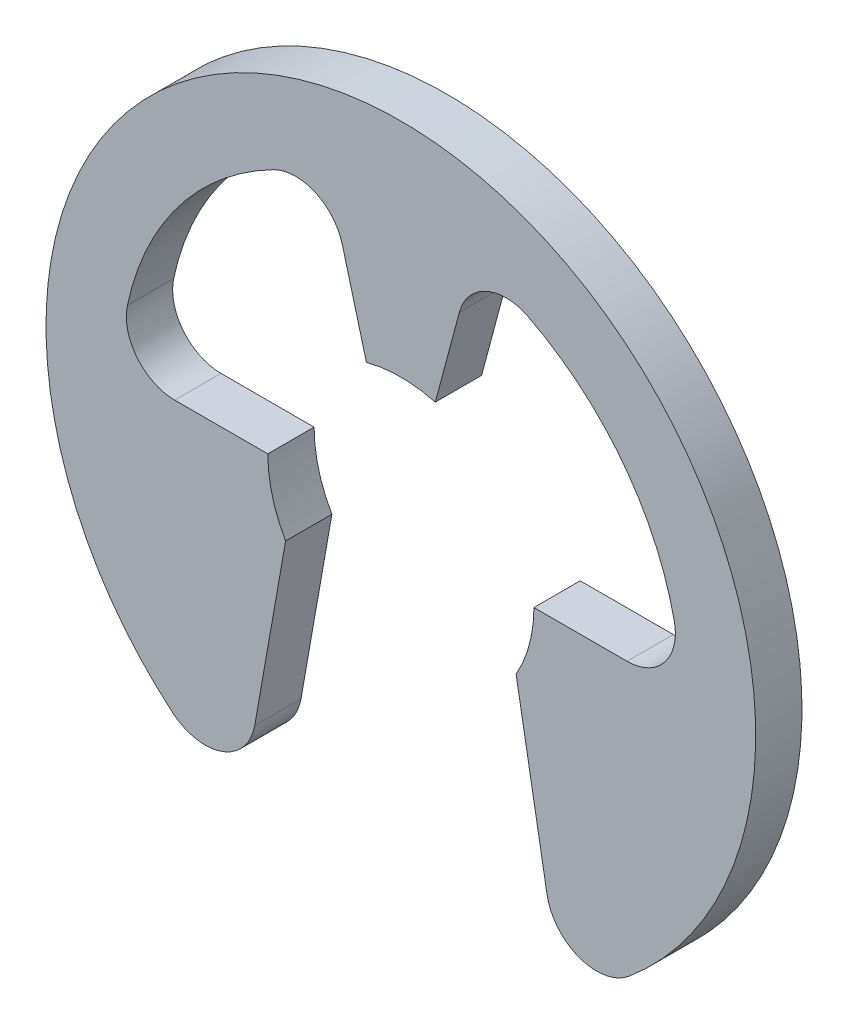
ISO-10303-21;
HEADER;
FILE_DESCRIPTION(('STEP AP214'),'2;1');
FILE_NAME('part.step','',(''),(''),'','','');
FILE_SCHEMA(('AUTOMOTIVE_DESIGN { 1 0 10303 214 1 1 1 1 }'));
ENDSEC;
DATA;
#1=APPLICATION_CONTEXT('core data for automotive mechanical design processes');
#2=APPLICATION_PROTOCOL_DEFINITION('international standard','automotive_design',2000,#1);
#3=PRODUCT_CONTEXT('',#1,'mechanical');
#4=PRODUCT('Part','Part','',(#3));
#5=PRODUCT_RELATED_PRODUCT_CATEGORY('part','',(#4));
#6=PRODUCT_DEFINITION_FORMATION('','',#4);
#7=PRODUCT_DEFINITION_CONTEXT('part definition',#1,'design');
#8=PRODUCT_DEFINITION('design','',#6,#7);
#9=PRODUCT_DEFINITION_SHAPE('','',#8);
#10=(LENGTH_UNIT() NAMED_UNIT(*) SI_UNIT(.MILLI.,.METRE.));
#11=(NAMED_UNIT(*) PLANE_ANGLE_UNIT() SI_UNIT($,.RADIAN.));
#12=(NAMED_UNIT(*) SI_UNIT($,.STERADIAN.) SOLID_ANGLE_UNIT());
#13=UNCERTAINTY_MEASURE_WITH_UNIT(LENGTH_MEASURE(1.E-05),#10,'distance_accuracy_value','');
#14=(GEOMETRIC_REPRESENTATION_CONTEXT(3) GLOBAL_UNCERTAINTY_ASSIGNED_CONTEXT((#13)) GLOBAL_UNIT_ASSIGNED_CONTEXT((#10,
#11,#12)) REPRESENTATION_CONTEXT('',''));
#15=CARTESIAN_POINT('',(0.,0.,0.));
#16=DIRECTION('',(0.,0.,1.));
#17=DIRECTION('',(1.,0.,0.));
#18=AXIS2_PLACEMENT_3D('',#15,#16,#17);
#19=CARTESIAN_POINT('',(1.95446781616986,0.418,-0.4));
#20=DIRECTION('',(0.,0.,1.));
#21=DIRECTION('',(1.,0.,0.));
#22=AXIS2_PLACEMENT_3D('',#19,#20,#21);
#23=CYLINDRICAL_SURFACE('',#22,0.418);
#24=CARTESIAN_POINT('',(1.95446781616986,0.418,0.));
#25=DIRECTION('',(0.,0.,-1.));
#26=DIRECTION('',(1.,0.,0.));
#27=AXIS2_PLACEMENT_3D('',#24,#25,#26);
#28=CIRCLE('',#27,0.418);
#29=CARTESIAN_POINT('',(2.36322409393457,0.505420280186798,0.));
#30=VERTEX_POINT('',#29);
#31=CARTESIAN_POINT('',(1.95446781616986,0.,0.));
#32=VERTEX_POINT('',#31);
#33=EDGE_CURVE('E194',#30,#32,#28,.T.);
#34=ORIENTED_EDGE('',*,*,#33,.F.);
#35=DIRECTION('',(0.,0.,1.));
#36=VECTOR('',#35,1.);
#37=CARTESIAN_POINT('',(2.36322409393457,0.505420280186798,-0.4));
#38=LINE('',#37,#36);
#39=CARTESIAN_POINT('',(2.36322409393457,0.505420280186798,-0.4));
#40=VERTEX_POINT('',#39);
#41=EDGE_CURVE('E11',#40,#30,#38,.T.);
#42=ORIENTED_EDGE('',*,*,#41,.F.);
#43=CARTESIAN_POINT('',(1.95446781616986,0.418,-0.4));
#44=DIRECTION('',(0.,0.,-1.));
#45=DIRECTION('',(1.,0.,0.));
#46=AXIS2_PLACEMENT_3D('',#43,#44,#45);
#47=CIRCLE('',#46,0.418);
#48=CARTESIAN_POINT('',(1.95446781616986,0.,-0.4));
#49=VERTEX_POINT('',#48);
#50=EDGE_CURVE('E244',#40,#49,#47,.T.);
#51=ORIENTED_EDGE('',*,*,#50,.T.);
#52=DIRECTION('',(0.,0.,1.));
#53=VECTOR('',#52,1.);
#54=CARTESIAN_POINT('',(1.95446781616986,0.,-0.4));
#55=LINE('',#54,#53);
#56=EDGE_CURVE('E40',#49,#32,#55,.T.);
#57=ORIENTED_EDGE('',*,*,#56,.T.);
#58=EDGE_LOOP('',(#34,#42,#51,#57));
#59=FACE_BOUND('',#58,.T.);
#60=ADVANCED_FACE('F37',(#59),#23,.F.);
#61=CARTESIAN_POINT('',(0.,0.,-0.4));
#62=DIRECTION('',(0.,0.,1.));
#63=DIRECTION('',(1.,0.,0.));
#64=AXIS2_PLACEMENT_3D('',#61,#62,#63);
#65=CYLINDRICAL_SURFACE('',#64,2.4166666666665);
#66=CARTESIAN_POINT('',(0.,0.,0.));
#67=DIRECTION('',(0.,0.,-1.));
#68=DIRECTION('',(1.,0.,0.));
#69=AXIS2_PLACEMENT_3D('',#66,#67,#68);
#70=CIRCLE('',#69,2.4166666666665);
#71=CARTESIAN_POINT('',(1.0998459051181,2.15188679134659,0.));
#72=VERTEX_POINT('',#71);
#73=EDGE_CURVE('E242',#72,#30,#70,.T.);
#74=ORIENTED_EDGE('',*,*,#73,.F.);
#75=DIRECTION('',(0.,0.,1.));
#76=VECTOR('',#75,1.);
#77=CARTESIAN_POINT('',(1.0998459051181,2.15188679134659,-0.4));
#78=LINE('',#77,#76);
#79=CARTESIAN_POINT('',(1.0998459051181,2.15188679134659,-0.4));
#80=VERTEX_POINT('',#79);
#81=EDGE_CURVE('E46',#80,#72,#78,.T.);
#82=ORIENTED_EDGE('',*,*,#81,.F.);
#83=CARTESIAN_POINT('',(0.,0.,-0.4));
#84=DIRECTION('',(0.,0.,-1.));
#85=DIRECTION('',(1.,0.,0.));
#86=AXIS2_PLACEMENT_3D('',#83,#84,#85);
#87=CIRCLE('',#86,2.4166666666665);
#88=EDGE_CURVE('E184',#80,#40,#87,.T.);
#89=ORIENTED_EDGE('',*,*,#88,.T.);
#90=ORIENTED_EDGE('',*,*,#41,.T.);
#91=EDGE_LOOP('',(#74,#82,#89,#90));
#92=FACE_BOUND('',#91,.T.);
#93=ADVANCED_FACE('F276',(#92),#65,.F.);
#94=CARTESIAN_POINT('',(0.909610489253524,1.77968457943641,-0.4));
#95=DIRECTION('',(0.,0.,1.));
#96=DIRECTION('',(1.,0.,0.));
#97=AXIS2_PLACEMENT_3D('',#94,#95,#96);
#98=CYLINDRICAL_SURFACE('',#97,0.418);
#99=CARTESIAN_POINT('',(0.909610489253524,1.77968457943641,0.));
#100=DIRECTION('',(0.,0.,-1.));
#101=DIRECTION('',(1.,0.,0.));
#102=AXIS2_PLACEMENT_3D('',#99,#100,#101);
#103=CIRCLE('',#102,0.418);
#104=CARTESIAN_POINT('',(0.505853493864694,1.88787094028926,0.));
#105=VERTEX_POINT('',#104);
#106=EDGE_CURVE('E171',#105,#72,#103,.T.);
#107=ORIENTED_EDGE('',*,*,#106,.F.);
#108=DIRECTION('',(0.,0.,1.));
#109=VECTOR('',#108,1.);
#110=CARTESIAN_POINT('',(0.505853493864694,1.88787094028926,-0.4));
#111=LINE('',#110,#109);
#112=CARTESIAN_POINT('',(0.505853493864694,1.88787094028926,-0.4));
#113=VERTEX_POINT('',#112);
#114=EDGE_CURVE('E166',#113,#105,#111,.T.);
#115=ORIENTED_EDGE('',*,*,#114,.F.);
#116=CARTESIAN_POINT('',(0.909610489253524,1.77968457943641,-0.4));
#117=DIRECTION('',(0.,0.,-1.));
#118=DIRECTION('',(1.,0.,0.));
#119=AXIS2_PLACEMENT_3D('',#116,#117,#118);
#120=CIRCLE('',#119,0.418);
#121=EDGE_CURVE('E169',#113,#80,#120,.T.);
#122=ORIENTED_EDGE('',*,*,#121,.T.);
#123=ORIENTED_EDGE('',*,*,#81,.T.);
#124=EDGE_LOOP('',(#107,#115,#122,#123));
#125=FACE_BOUND('',#124,.T.);
#126=ADVANCED_FACE('F168',(#125),#98,.F.);
#127=CARTESIAN_POINT('',(0.2976419018679,1.11081470023243,-0.4));
#128=DIRECTION('',(0.965925826289068,-0.258819045102522,0.));
#129=DIRECTION('',(0.258819045102522,0.965925826289068,0.));
#130=AXIS2_PLACEMENT_3D('',#127,#128,#129);
#131=PLANE('',#130);
#132=DIRECTION('',(0.258819045102522,0.965925826289068,0.));
#133=VECTOR('',#132,1.);
#134=CARTESIAN_POINT('',(0.2976419018679,1.11081470023243,0.));
#135=LINE('',#134,#133);
#136=CARTESIAN_POINT('',(0.2976419018679,1.11081470023243,0.));
#137=VERTEX_POINT('',#136);
#138=EDGE_CURVE('E239',#137,#105,#135,.T.);
#139=ORIENTED_EDGE('',*,*,#138,.F.);
#140=DIRECTION('',(0.,0.,1.));
#141=VECTOR('',#140,1.);
#142=CARTESIAN_POINT('',(0.2976419018679,1.11081470023243,-0.4));
#143=LINE('',#142,#141);
#144=CARTESIAN_POINT('',(0.2976419018679,1.11081470023243,-0.4));
#145=VERTEX_POINT('',#144);
#146=EDGE_CURVE('E176',#145,#137,#143,.T.);
#147=ORIENTED_EDGE('',*,*,#146,.F.);
#148=DIRECTION('',(0.258819045102522,0.965925826289068,0.));
#149=VECTOR('',#148,1.);
#150=CARTESIAN_POINT('',(0.2976419018679,1.11081470023243,-0.4));
#151=LINE('',#150,#149);
#152=EDGE_CURVE('E182',#145,#113,#151,.T.);
#153=ORIENTED_EDGE('',*,*,#152,.T.);
#154=ORIENTED_EDGE('',*,*,#114,.T.);
#155=EDGE_LOOP('',(#139,#147,#153,#154));
#156=FACE_BOUND('',#155,.T.);
#157=ADVANCED_FACE('F186',(#156),#131,.T.);
#158=CARTESIAN_POINT('',(0.,0.,-0.4));
#159=DIRECTION('',(0.,0.,1.));
#160=DIRECTION('',(1.,0.,0.));
#161=AXIS2_PLACEMENT_3D('',#158,#159,#160);
#162=CYLINDRICAL_SURFACE('',#161,1.15);
#163=CARTESIAN_POINT('',(0.,0.,0.));
#164=DIRECTION('',(0.,0.,-1.));
#165=DIRECTION('',(-1.,0.,0.));
#166=AXIS2_PLACEMENT_3D('',#163,#164,#165);
#167=CIRCLE('',#166,1.15);
#168=CARTESIAN_POINT('',(-0.2976419018679,1.11081470023243,0.));
#169=VERTEX_POINT('',#168);
#170=EDGE_CURVE('E236',#169,#137,#167,.T.);
#171=ORIENTED_EDGE('',*,*,#170,.F.);
#172=DIRECTION('',(0.,0.,1.));
#173=VECTOR('',#172,1.);
#174=CARTESIAN_POINT('',(-0.2976419018679,1.11081470023243,-0.4));
#175=LINE('',#174,#173);
#176=CARTESIAN_POINT('',(-0.2976419018679,1.11081470023243,-0.4));
#177=VERTEX_POINT('',#176);
#178=EDGE_CURVE('E248',#177,#169,#175,.T.);
#179=ORIENTED_EDGE('',*,*,#178,.F.);
#180=CARTESIAN_POINT('',(0.,0.,-0.4));
#181=DIRECTION('',(0.,0.,-1.));
#182=DIRECTION('',(-1.,0.,0.));
#183=AXIS2_PLACEMENT_3D('',#180,#181,#182);
#184=CIRCLE('',#183,1.15);
#185=EDGE_CURVE('E187',#177,#145,#184,.T.);
#186=ORIENTED_EDGE('',*,*,#185,.T.);
#187=ORIENTED_EDGE('',*,*,#146,.T.);
#188=EDGE_LOOP('',(#171,#179,#186,#187));
#189=FACE_BOUND('',#188,.T.);
#190=ADVANCED_FACE('F289',(#189),#162,.F.);
#191=CARTESIAN_POINT('',(-0.2976419018679,1.11081470023243,-0.4));
#192=DIRECTION('',(-0.965925826289068,-0.258819045102522,0.));
#193=DIRECTION('',(0.258819045102522,-0.965925826289068,0.));
#194=AXIS2_PLACEMENT_3D('',#191,#192,#193);
#195=PLANE('',#194);
#196=DIRECTION('',(0.258819045102522,-0.965925826289068,0.));
#197=VECTOR('',#196,1.);
#198=CARTESIAN_POINT('',(-0.2976419018679,1.11081470023243,0.));
#199=LINE('',#198,#197);
#200=CARTESIAN_POINT('',(-0.505853493864694,1.88787094028926,0.));
#201=VERTEX_POINT('',#200);
#202=EDGE_CURVE('E233',#201,#169,#199,.T.);
#203=ORIENTED_EDGE('',*,*,#202,.F.);
#204=DIRECTION('',(0.,0.,1.));
#205=VECTOR('',#204,1.);
#206=CARTESIAN_POINT('',(-0.505853493864694,1.88787094028926,-0.4));
#207=LINE('',#206,#205);
#208=CARTESIAN_POINT('',(-0.505853493864694,1.88787094028926,-0.4));
#209=VERTEX_POINT('',#208);
#210=EDGE_CURVE('E250',#209,#201,#207,.T.);
#211=ORIENTED_EDGE('',*,*,#210,.F.);
#212=DIRECTION('',(0.258819045102522,-0.965925826289068,0.));
#213=VECTOR('',#212,1.);
#214=CARTESIAN_POINT('',(-0.2976419018679,1.11081470023243,-0.4));
#215=LINE('',#214,#213);
#216=EDGE_CURVE('E189',#209,#177,#215,.T.);
#217=ORIENTED_EDGE('',*,*,#216,.T.);
#218=ORIENTED_EDGE('',*,*,#178,.T.);
#219=EDGE_LOOP('',(#203,#211,#217,#218));
#220=FACE_BOUND('',#219,.T.);
#221=ADVANCED_FACE('F292',(#220),#195,.T.);
#222=CARTESIAN_POINT('',(-0.909610489253524,1.77968457943641,-0.4));
#223=DIRECTION('',(0.,0.,1.));
#224=DIRECTION('',(1.,0.,0.));
#225=AXIS2_PLACEMENT_3D('',#222,#223,#224);
#226=CYLINDRICAL_SURFACE('',#225,0.418);
#227=CARTESIAN_POINT('',(-0.909610489253524,1.77968457943641,0.));
#228=DIRECTION('',(0.,0.,-1.));
#229=DIRECTION('',(1.,0.,0.));
#230=AXIS2_PLACEMENT_3D('',#227,#228,#229);
#231=CIRCLE('',#230,0.418);
#232=CARTESIAN_POINT('',(-1.0998459051181,2.15188679134659,0.));
#233=VERTEX_POINT('',#232);
#234=EDGE_CURVE('E230',#233,#201,#231,.T.);
#235=ORIENTED_EDGE('',*,*,#234,.F.);
#236=DIRECTION('',(0.,0.,1.));
#237=VECTOR('',#236,1.);
#238=CARTESIAN_POINT('',(-1.0998459051181,2.15188679134659,-0.4));
#239=LINE('',#238,#237);
#240=CARTESIAN_POINT('',(-1.0998459051181,2.15188679134659,-0.4));
#241=VERTEX_POINT('',#240);
#242=EDGE_CURVE('E252',#241,#233,#239,.T.);
#243=ORIENTED_EDGE('',*,*,#242,.F.);
#244=CARTESIAN_POINT('',(-0.909610489253524,1.77968457943641,-0.4));
#245=DIRECTION('',(0.,0.,-1.));
#246=DIRECTION('',(1.,0.,0.));
#247=AXIS2_PLACEMENT_3D('',#244,#245,#246);
#248=CIRCLE('',#247,0.418);
#249=EDGE_CURVE('E540',#241,#209,#248,.T.);
#250=ORIENTED_EDGE('',*,*,#249,.T.);
#251=ORIENTED_EDGE('',*,*,#210,.T.);
#252=EDGE_LOOP('',(#235,#243,#250,#251));
#253=FACE_BOUND('',#252,.T.);
#254=ADVANCED_FACE('F296',(#253),#226,.F.);
#255=CARTESIAN_POINT('',(0.,0.,-0.4));
#256=DIRECTION('',(0.,0.,1.));
#257=DIRECTION('',(1.,0.,0.));
#258=AXIS2_PLACEMENT_3D('',#255,#256,#257);
#259=CYLINDRICAL_SURFACE('',#258,2.4166666666665);
#260=CARTESIAN_POINT('',(0.,0.,0.));
#261=DIRECTION('',(0.,0.,-1.));
#262=DIRECTION('',(1.,0.,0.));
#263=AXIS2_PLACEMENT_3D('',#260,#261,#262);
#264=CIRCLE('',#263,2.4166666666665);
#265=CARTESIAN_POINT('',(-2.36322409393457,0.505420280186798,0.));
#266=VERTEX_POINT('',#265);
#267=EDGE_CURVE('E227',#266,#233,#264,.T.);
#268=ORIENTED_EDGE('',*,*,#267,.F.);
#269=DIRECTION('',(0.,0.,1.));
#270=VECTOR('',#269,1.);
#271=CARTESIAN_POINT('',(-2.36322409393457,0.505420280186798,-0.4));
#272=LINE('',#271,#270);
#273=CARTESIAN_POINT('',(-2.36322409393457,0.505420280186798,-0.4));
#274=VERTEX_POINT('',#273);
#275=EDGE_CURVE('E254',#274,#266,#272,.T.);
#276=ORIENTED_EDGE('',*,*,#275,.F.);
#277=CARTESIAN_POINT('',(0.,0.,-0.4));
#278=DIRECTION('',(0.,0.,-1.));
#279=DIRECTION('',(1.,0.,0.));
#280=AXIS2_PLACEMENT_3D('',#277,#278,#279);
#281=CIRCLE('',#280,2.4166666666665);
#282=EDGE_CURVE('E544',#274,#241,#281,.T.);
#283=ORIENTED_EDGE('',*,*,#282,.T.);
#284=ORIENTED_EDGE('',*,*,#242,.T.);
#285=EDGE_LOOP('',(#268,#276,#283,#284));
#286=FACE_BOUND('',#285,.T.);
#287=ADVANCED_FACE('F300',(#286),#259,.F.);
#288=CARTESIAN_POINT('',(-1.95446781616986,0.418,-0.4));
#289=DIRECTION('',(0.,0.,1.));
#290=DIRECTION('',(1.,0.,0.));
#291=AXIS2_PLACEMENT_3D('',#288,#289,#290);
#292=CYLINDRICAL_SURFACE('',#291,0.418);
#293=CARTESIAN_POINT('',(-1.95446781616986,0.418,0.));
#294=DIRECTION('',(0.,0.,-1.));
#295=DIRECTION('',(1.,0.,0.));
#296=AXIS2_PLACEMENT_3D('',#293,#294,#295);
#297=CIRCLE('',#296,0.418);
#298=CARTESIAN_POINT('',(-1.95446781616986,0.,0.));
#299=VERTEX_POINT('',#298);
#300=EDGE_CURVE('E224',#299,#266,#297,.T.);
#301=ORIENTED_EDGE('',*,*,#300,.F.);
#302=DIRECTION('',(0.,0.,1.));
#303=VECTOR('',#302,1.);
#304=CARTESIAN_POINT('',(-1.95446781616986,0.,-0.4));
#305=LINE('',#304,#303);
#306=CARTESIAN_POINT('',(-1.95446781616986,0.,-0.4));
#307=VERTEX_POINT('',#306);
#308=EDGE_CURVE('E256',#307,#299,#305,.T.);
#309=ORIENTED_EDGE('',*,*,#308,.F.);
#310=CARTESIAN_POINT('',(-1.95446781616986,0.418,-0.4));
#311=DIRECTION('',(0.,0.,-1.));
#312=DIRECTION('',(1.,0.,0.));
#313=AXIS2_PLACEMENT_3D('',#310,#311,#312);
#314=CIRCLE('',#313,0.418);
#315=EDGE_CURVE('E533',#307,#274,#314,.T.);
#316=ORIENTED_EDGE('',*,*,#315,.T.);
#317=ORIENTED_EDGE('',*,*,#275,.T.);
#318=EDGE_LOOP('',(#301,#309,#316,#317));
#319=FACE_BOUND('',#318,.T.);
#320=ADVANCED_FACE('F304',(#319),#292,.F.);
#321=CARTESIAN_POINT('',(-1.15,0.,-0.4));
#322=DIRECTION('',(0.,1.,0.));
#323=DIRECTION('',(-1.,0.,0.));
#324=AXIS2_PLACEMENT_3D('',#321,#322,#323);
#325=PLANE('',#324);
#326=DIRECTION('',(-1.,0.,0.));
#327=VECTOR('',#326,1.);
#328=CARTESIAN_POINT('',(-1.15,0.,0.));
#329=LINE('',#328,#327);
#330=CARTESIAN_POINT('',(-1.15,0.,0.));
#331=VERTEX_POINT('',#330);
#332=EDGE_CURVE('E221',#331,#299,#329,.T.);
#333=ORIENTED_EDGE('',*,*,#332,.F.);
#334=DIRECTION('',(0.,0.,1.));
#335=VECTOR('',#334,1.);
#336=CARTESIAN_POINT('',(-1.15,0.,-0.4));
#337=LINE('',#336,#335);
#338=CARTESIAN_POINT('',(-1.15,0.,-0.4));
#339=VERTEX_POINT('',#338);
#340=EDGE_CURVE('E258',#339,#331,#337,.T.);
#341=ORIENTED_EDGE('',*,*,#340,.F.);
#342=DIRECTION('',(-1.,0.,0.));
#343=VECTOR('',#342,1.);
#344=CARTESIAN_POINT('',(-1.15,0.,-0.4));
#345=LINE('',#344,#343);
#346=EDGE_CURVE('E529',#339,#307,#345,.T.);
#347=ORIENTED_EDGE('',*,*,#346,.T.);
#348=ORIENTED_EDGE('',*,*,#308,.T.);
#349=EDGE_LOOP('',(#333,#341,#347,#348));
#350=FACE_BOUND('',#349,.T.);
#351=ADVANCED_FACE('F308',(#350),#325,.T.);
#352=CARTESIAN_POINT('',(0.,0.,-0.4));
#353=DIRECTION('',(0.,0.,1.));
#354=DIRECTION('',(1.,0.,0.));
#355=AXIS2_PLACEMENT_3D('',#352,#353,#354);
#356=CYLINDRICAL_SURFACE('',#355,1.15);
#357=CARTESIAN_POINT('',(0.,0.,0.));
#358=DIRECTION('',(0.,0.,-1.));
#359=DIRECTION('',(1.,0.,0.));
#360=AXIS2_PLACEMENT_3D('',#357,#358,#359);
#361=CIRCLE('',#360,1.15);
#362=CARTESIAN_POINT('',(-0.995929214352104,-0.575000000000001,0.));
#363=VERTEX_POINT('',#362);
#364=EDGE_CURVE('E218',#363,#331,#361,.T.);
#365=ORIENTED_EDGE('',*,*,#364,.F.);
#366=DIRECTION('',(0.,0.,1.));
#367=VECTOR('',#366,1.);
#368=CARTESIAN_POINT('',(-0.995929214352104,-0.575000000000001,-0.4));
#369=LINE('',#368,#367);
#370=CARTESIAN_POINT('',(-0.995929214352104,-0.575000000000001,-0.4));
#371=VERTEX_POINT('',#370);
#372=EDGE_CURVE('E260',#371,#363,#369,.T.);
#373=ORIENTED_EDGE('',*,*,#372,.F.);
#374=CARTESIAN_POINT('',(0.,0.,-0.4));
#375=DIRECTION('',(0.,0.,-1.));
#376=DIRECTION('',(1.,0.,0.));
#377=AXIS2_PLACEMENT_3D('',#374,#375,#376);
#378=CIRCLE('',#377,1.15);
#379=EDGE_CURVE('E550',#371,#339,#378,.T.);
#380=ORIENTED_EDGE('',*,*,#379,.T.);
#381=ORIENTED_EDGE('',*,*,#340,.T.);
#382=EDGE_LOOP('',(#365,#373,#380,#381));
#383=FACE_BOUND('',#382,.T.);
#384=ADVANCED_FACE('F312',(#383),#356,.F.);
#385=CARTESIAN_POINT('',(-0.995929214352104,-0.575000000000001,-0.4));
#386=DIRECTION('',(0.984807753012208,-0.17364817766693,0.));
#387=DIRECTION('',(0.17364817766693,0.984807753012208,0.));
#388=AXIS2_PLACEMENT_3D('',#385,#386,#387);
#389=PLANE('',#388);
#390=DIRECTION('',(0.17364817766693,0.984807753012208,0.));
#391=VECTOR('',#390,1.);
#392=CARTESIAN_POINT('',(-0.995929214352104,-0.575000000000001,0.));
#393=LINE('',#392,#391);
#394=CARTESIAN_POINT('',(-1.26316511081154,-2.09057008113962,0.));
#395=VERTEX_POINT('',#394);
#396=EDGE_CURVE('E215',#395,#363,#393,.T.);
#397=ORIENTED_EDGE('',*,*,#396,.F.);
#398=DIRECTION('',(0.,0.,1.));
#399=VECTOR('',#398,1.);
#400=CARTESIAN_POINT('',(-1.26316511081154,-2.09057008113962,-0.4));
#401=LINE('',#400,#399);
#402=CARTESIAN_POINT('',(-1.26316511081154,-2.09057008113962,-0.4));
#403=VERTEX_POINT('',#402);
#404=EDGE_CURVE('E262',#403,#395,#401,.T.);
#405=ORIENTED_EDGE('',*,*,#404,.F.);
#406=DIRECTION('',(0.17364817766693,0.984807753012208,0.));
#407=VECTOR('',#406,1.);
#408=CARTESIAN_POINT('',(-0.995929214352104,-0.575000000000001,-0.4));
#409=LINE('',#408,#407);
#410=EDGE_CURVE('E522',#403,#371,#409,.T.);
#411=ORIENTED_EDGE('',*,*,#410,.T.);
#412=ORIENTED_EDGE('',*,*,#372,.T.);
#413=EDGE_LOOP('',(#397,#405,#411,#412));
#414=FACE_BOUND('',#413,.T.);
#415=ADVANCED_FACE('F316',(#414),#389,.T.);
#416=CARTESIAN_POINT('',(-1.69204888724835,-2.01494629976567,-0.4));
#417=DIRECTION('',(0.,0.,1.));
#418=DIRECTION('',(1.,0.,0.));
#419=AXIS2_PLACEMENT_3D('',#416,#417,#418);
#420=CYLINDRICAL_SURFACE('',#419,0.4355);
#421=CARTESIAN_POINT('',(-1.69204888724835,-2.01494629976567,0.));
#422=DIRECTION('',(0.,0.,1.));
#423=DIRECTION('',(1.,0.,0.));
#424=AXIS2_PLACEMENT_3D('',#421,#422,#423);
#425=CIRCLE('',#424,0.4355);
#426=CARTESIAN_POINT('',(-1.97210993382971,-2.34845201214217,0.));
#427=VERTEX_POINT('',#426);
#428=EDGE_CURVE('E212',#427,#395,#425,.T.);
#429=ORIENTED_EDGE('',*,*,#428,.F.);
#430=DIRECTION('',(0.,0.,1.));
#431=VECTOR('',#430,1.);
#432=CARTESIAN_POINT('',(-1.97210993382971,-2.34845201214217,-0.4));
#433=LINE('',#432,#431);
#434=CARTESIAN_POINT('',(-1.97210993382971,-2.34845201214217,-0.4));
#435=VERTEX_POINT('',#434);
#436=EDGE_CURVE('E264',#435,#427,#433,.T.);
#437=ORIENTED_EDGE('',*,*,#436,.F.);
#438=CARTESIAN_POINT('',(-1.69204888724835,-2.01494629976567,-0.4));
#439=DIRECTION('',(0.,0.,1.));
#440=DIRECTION('',(1.,0.,0.));
#441=AXIS2_PLACEMENT_3D('',#438,#439,#440);
#442=CIRCLE('',#441,0.4355);
#443=EDGE_CURVE('E518',#435,#403,#442,.T.);
#444=ORIENTED_EDGE('',*,*,#443,.T.);
#445=ORIENTED_EDGE('',*,*,#404,.T.);
#446=EDGE_LOOP('',(#429,#437,#444,#445));
#447=FACE_BOUND('',#446,.T.);
#448=ADVANCED_FACE('F320',(#447),#420,.T.);
#449=CARTESIAN_POINT('',(0.,0.,-0.4));
#450=DIRECTION('',(0.,0.,1.));
#451=DIRECTION('',(1.,0.,0.));
#452=AXIS2_PLACEMENT_3D('',#449,#450,#451);
#453=CYLINDRICAL_SURFACE('',#452,3.06666666666667);
#454=CARTESIAN_POINT('',(0.,0.,0.));
#455=DIRECTION('',(0.,0.,1.));
#456=DIRECTION('',(1.,0.,0.));
#457=AXIS2_PLACEMENT_3D('',#454,#455,#456);
#458=CIRCLE('',#457,3.06666666666667);
#459=CARTESIAN_POINT('',(1.97210993382971,-2.34845201214217,0.));
#460=VERTEX_POINT('',#459);
#461=EDGE_CURVE('E209',#460,#427,#458,.T.);
#462=ORIENTED_EDGE('',*,*,#461,.F.);
#463=DIRECTION('',(0.,0.,1.));
#464=VECTOR('',#463,1.);
#465=CARTESIAN_POINT('',(1.97210993382971,-2.34845201214217,-0.4));
#466=LINE('',#465,#464);
#467=CARTESIAN_POINT('',(1.97210993382971,-2.34845201214217,-0.4));
#468=VERTEX_POINT('',#467);
#469=EDGE_CURVE('E266',#468,#460,#466,.T.);
#470=ORIENTED_EDGE('',*,*,#469,.F.);
#471=CARTESIAN_POINT('',(0.,0.,-0.4));
#472=DIRECTION('',(0.,0.,1.));
#473=DIRECTION('',(1.,0.,0.));
#474=AXIS2_PLACEMENT_3D('',#471,#472,#473);
#475=CIRCLE('',#474,3.06666666666667);
#476=EDGE_CURVE('E554',#468,#435,#475,.T.);
#477=ORIENTED_EDGE('',*,*,#476,.T.);
#478=ORIENTED_EDGE('',*,*,#436,.T.);
#479=EDGE_LOOP('',(#462,#470,#477,#478));
#480=FACE_BOUND('',#479,.T.);
#481=ADVANCED_FACE('F324',(#480),#453,.T.);
#482=CARTESIAN_POINT('',(1.69204888724835,-2.01494629976567,-0.4));
#483=DIRECTION('',(0.,0.,1.));
#484=DIRECTION('',(1.,0.,0.));
#485=AXIS2_PLACEMENT_3D('',#482,#483,#484);
#486=CYLINDRICAL_SURFACE('',#485,0.4355);
#487=CARTESIAN_POINT('',(1.69204888724835,-2.01494629976567,0.));
#488=DIRECTION('',(0.,0.,1.));
#489=DIRECTION('',(1.,0.,0.));
#490=AXIS2_PLACEMENT_3D('',#487,#488,#489);
#491=CIRCLE('',#490,0.4355);
#492=CARTESIAN_POINT('',(1.26316511081154,-2.09057008113962,0.));
#493=VERTEX_POINT('',#492);
#494=EDGE_CURVE('E206',#493,#460,#491,.T.);
#495=ORIENTED_EDGE('',*,*,#494,.F.);
#496=DIRECTION('',(0.,0.,1.));
#497=VECTOR('',#496,1.);
#498=CARTESIAN_POINT('',(1.26316511081154,-2.09057008113962,-0.4));
#499=LINE('',#498,#497);
#500=CARTESIAN_POINT('',(1.26316511081154,-2.09057008113962,-0.4));
#501=VERTEX_POINT('',#500);
#502=EDGE_CURVE('E268',#501,#493,#499,.T.);
#503=ORIENTED_EDGE('',*,*,#502,.F.);
#504=CARTESIAN_POINT('',(1.69204888724835,-2.01494629976567,-0.4));
#505=DIRECTION('',(0.,0.,1.));
#506=DIRECTION('',(1.,0.,0.));
#507=AXIS2_PLACEMENT_3D('',#504,#505,#506);
#508=CIRCLE('',#507,0.4355);
#509=EDGE_CURVE('E511',#501,#468,#508,.T.);
#510=ORIENTED_EDGE('',*,*,#509,.T.);
#511=ORIENTED_EDGE('',*,*,#469,.T.);
#512=EDGE_LOOP('',(#495,#503,#510,#511));
#513=FACE_BOUND('',#512,.T.);
#514=ADVANCED_FACE('F328',(#513),#486,.T.);
#515=CARTESIAN_POINT('',(0.995929214352104,-0.575000000000001,-0.4));
#516=DIRECTION('',(-0.984807753012208,-0.17364817766693,0.));
#517=DIRECTION('',(0.17364817766693,-0.984807753012208,0.));
#518=AXIS2_PLACEMENT_3D('',#515,#516,#517);
#519=PLANE('',#518);
#520=DIRECTION('',(0.17364817766693,-0.984807753012208,0.));
#521=VECTOR('',#520,1.);
#522=CARTESIAN_POINT('',(0.995929214352104,-0.575000000000001,0.));
#523=LINE('',#522,#521);
#524=CARTESIAN_POINT('',(0.995929214352104,-0.575000000000001,0.));
#525=VERTEX_POINT('',#524);
#526=EDGE_CURVE('E203',#525,#493,#523,.T.);
#527=ORIENTED_EDGE('',*,*,#526,.F.);
#528=DIRECTION('',(0.,0.,1.));
#529=VECTOR('',#528,1.);
#530=CARTESIAN_POINT('',(0.995929214352104,-0.575000000000001,-0.4));
#531=LINE('',#530,#529);
#532=CARTESIAN_POINT('',(0.995929214352104,-0.575000000000001,-0.4));
#533=VERTEX_POINT('',#532);
#534=EDGE_CURVE('E270',#533,#525,#531,.T.);
#535=ORIENTED_EDGE('',*,*,#534,.F.);
#536=DIRECTION('',(0.17364817766693,-0.984807753012208,0.));
#537=VECTOR('',#536,1.);
#538=CARTESIAN_POINT('',(0.995929214352104,-0.575000000000001,-0.4));
#539=LINE('',#538,#537);
#540=EDGE_CURVE('E507',#533,#501,#539,.T.);
#541=ORIENTED_EDGE('',*,*,#540,.T.);
#542=ORIENTED_EDGE('',*,*,#502,.T.);
#543=EDGE_LOOP('',(#527,#535,#541,#542));
#544=FACE_BOUND('',#543,.T.);
#545=ADVANCED_FACE('F332',(#544),#519,.T.);
#546=CARTESIAN_POINT('',(0.,0.,-0.4));
#547=DIRECTION('',(0.,0.,1.));
#548=DIRECTION('',(1.,0.,0.));
#549=AXIS2_PLACEMENT_3D('',#546,#547,#548);
#550=CYLINDRICAL_SURFACE('',#549,1.15);
#551=CARTESIAN_POINT('',(0.,0.,0.));
#552=DIRECTION('',(0.,0.,-1.));
#553=DIRECTION('',(1.,0.,0.));
#554=AXIS2_PLACEMENT_3D('',#551,#552,#553);
#555=CIRCLE('',#554,1.15);
#556=CARTESIAN_POINT('',(1.15,0.,0.));
#557=VERTEX_POINT('',#556);
#558=EDGE_CURVE('E200',#557,#525,#555,.T.);
#559=ORIENTED_EDGE('',*,*,#558,.F.);
#560=DIRECTION('',(0.,0.,1.));
#561=VECTOR('',#560,1.);
#562=CARTESIAN_POINT('',(1.15,0.,-0.4));
#563=LINE('',#562,#561);
#564=CARTESIAN_POINT('',(1.15,0.,-0.4));
#565=VERTEX_POINT('',#564);
#566=EDGE_CURVE('E271',#565,#557,#563,.T.);
#567=ORIENTED_EDGE('',*,*,#566,.F.);
#568=CARTESIAN_POINT('',(0.,0.,-0.4));
#569=DIRECTION('',(0.,0.,-1.));
#570=DIRECTION('',(1.,0.,0.));
#571=AXIS2_PLACEMENT_3D('',#568,#569,#570);
#572=CIRCLE('',#571,1.15);
#573=EDGE_CURVE('E558',#565,#533,#572,.T.);
#574=ORIENTED_EDGE('',*,*,#573,.T.);
#575=ORIENTED_EDGE('',*,*,#534,.T.);
#576=EDGE_LOOP('',(#559,#567,#574,#575));
#577=FACE_BOUND('',#576,.T.);
#578=ADVANCED_FACE('F336',(#577),#550,.F.);
#579=CARTESIAN_POINT('',(1.15,0.,-0.4));
#580=DIRECTION('',(0.,1.,0.));
#581=DIRECTION('',(-1.,0.,0.));
#582=AXIS2_PLACEMENT_3D('',#579,#580,#581);
#583=PLANE('',#582);
#584=DIRECTION('',(-1.,0.,0.));
#585=VECTOR('',#584,1.);
#586=CARTESIAN_POINT('',(1.15,0.,0.));
#587=LINE('',#586,#585);
#588=EDGE_CURVE('E197',#32,#557,#587,.T.);
#589=ORIENTED_EDGE('',*,*,#588,.F.);
#590=ORIENTED_EDGE('',*,*,#56,.F.);
#591=DIRECTION('',(-1.,0.,0.));
#592=VECTOR('',#591,1.);
#593=CARTESIAN_POINT('',(1.15,0.,-0.4));
#594=LINE('',#593,#592);
#595=EDGE_CURVE('E560',#49,#565,#594,.T.);
#596=ORIENTED_EDGE('',*,*,#595,.T.);
#597=ORIENTED_EDGE('',*,*,#566,.T.);
#598=EDGE_LOOP('',(#589,#590,#596,#597));
#599=FACE_BOUND('',#598,.T.);
#600=ADVANCED_FACE('F273',(#599),#583,.T.);
#601=CARTESIAN_POINT('',(1.95446781616986,0.418,-0.4));
#602=DIRECTION('',(0.,0.,1.));
#603=DIRECTION('',(1.,0.,0.));
#604=AXIS2_PLACEMENT_3D('',#601,#602,#603);
#605=PLANE('',#604);
#606=ORIENTED_EDGE('',*,*,#50,.F.);
#607=ORIENTED_EDGE('',*,*,#88,.F.);
#608=ORIENTED_EDGE('',*,*,#121,.F.);
#609=ORIENTED_EDGE('',*,*,#152,.F.);
#610=ORIENTED_EDGE('',*,*,#185,.F.);
#611=ORIENTED_EDGE('',*,*,#216,.F.);
#612=ORIENTED_EDGE('',*,*,#249,.F.);
#613=ORIENTED_EDGE('',*,*,#282,.F.);
#614=ORIENTED_EDGE('',*,*,#315,.F.);
#615=ORIENTED_EDGE('',*,*,#346,.F.);
#616=ORIENTED_EDGE('',*,*,#379,.F.);
#617=ORIENTED_EDGE('',*,*,#410,.F.);
#618=ORIENTED_EDGE('',*,*,#443,.F.);
#619=ORIENTED_EDGE('',*,*,#476,.F.);
#620=ORIENTED_EDGE('',*,*,#509,.F.);
#621=ORIENTED_EDGE('',*,*,#540,.F.);
#622=ORIENTED_EDGE('',*,*,#573,.F.);
#623=ORIENTED_EDGE('',*,*,#595,.F.);
#624=EDGE_LOOP('',(#606,#607,#608,#609,#610,#611,#612,#613,#614,#615,#616,#617,#618,#619,#620,
#621,#622,#623));
#625=FACE_BOUND('',#624,.T.);
#626=ADVANCED_FACE('F180',(#625),#605,.F.);
#627=CARTESIAN_POINT('',(1.95446781616986,0.418,0.));
#628=DIRECTION('',(0.,0.,1.));
#629=DIRECTION('',(1.,0.,0.));
#630=AXIS2_PLACEMENT_3D('',#627,#628,#629);
#631=PLANE('',#630);
#632=ORIENTED_EDGE('',*,*,#33,.T.);
#633=ORIENTED_EDGE('',*,*,#588,.T.);
#634=ORIENTED_EDGE('',*,*,#558,.T.);
#635=ORIENTED_EDGE('',*,*,#526,.T.);
#636=ORIENTED_EDGE('',*,*,#494,.T.);
#637=ORIENTED_EDGE('',*,*,#461,.T.);
#638=ORIENTED_EDGE('',*,*,#428,.T.);
#639=ORIENTED_EDGE('',*,*,#396,.T.);
#640=ORIENTED_EDGE('',*,*,#364,.T.);
#641=ORIENTED_EDGE('',*,*,#332,.T.);
#642=ORIENTED_EDGE('',*,*,#300,.T.);
#643=ORIENTED_EDGE('',*,*,#267,.T.);
#644=ORIENTED_EDGE('',*,*,#234,.T.);
#645=ORIENTED_EDGE('',*,*,#202,.T.);
#646=ORIENTED_EDGE('',*,*,#170,.T.);
#647=ORIENTED_EDGE('',*,*,#138,.T.);
#648=ORIENTED_EDGE('',*,*,#106,.T.);
#649=ORIENTED_EDGE('',*,*,#73,.T.);
#650=EDGE_LOOP('',(#632,#633,#634,#635,#636,#637,#638,#639,#640,#641,#642,#643,#644,#645,#646,
#647,#648,#649));
#651=FACE_BOUND('',#650,.T.);
#652=ADVANCED_FACE('F275',(#651),#631,.T.);
#653=CLOSED_SHELL('',(#60,#93,#126,#157,#190,#221,#254,#287,#320,#351,#384,#415,#448,#481,#514,
#545,#578,#600,#626,#652));
#654=MANIFOLD_SOLID_BREP('B2',#653);
#655=ADVANCED_BREP_SHAPE_REPRESENTATION('',(#18,#654),#14);
#656=SHAPE_DEFINITION_REPRESENTATION(#9,#655);
ENDSEC;
END-ISO-10303-21;
